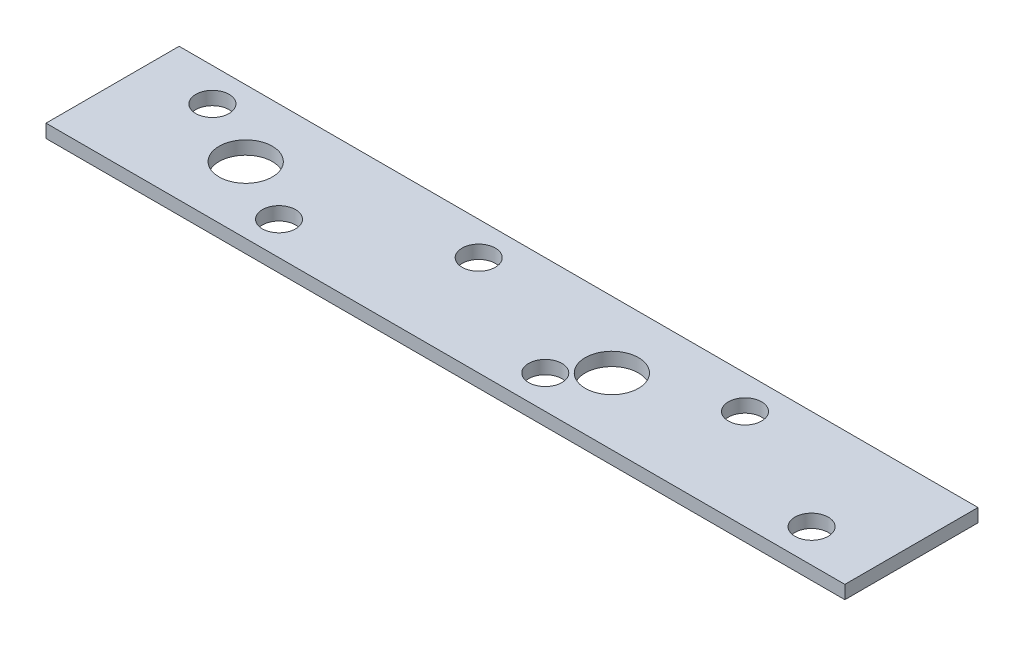
ISO-10303-21;
HEADER;
FILE_DESCRIPTION(('STEP AP214'),'2;1');
FILE_NAME('part.step','',(''),(''),'','','');
FILE_SCHEMA(('AUTOMOTIVE_DESIGN { 1 0 10303 214 1 1 1 1 }'));
ENDSEC;
DATA;
#1=APPLICATION_CONTEXT('core data for automotive mechanical design processes');
#2=APPLICATION_PROTOCOL_DEFINITION('international standard','automotive_design',2000,#1);
#3=PRODUCT_CONTEXT('',#1,'mechanical');
#4=PRODUCT('Part','Part','',(#3));
#5=PRODUCT_RELATED_PRODUCT_CATEGORY('part','',(#4));
#6=PRODUCT_DEFINITION_FORMATION('','',#4);
#7=PRODUCT_DEFINITION_CONTEXT('part definition',#1,'design');
#8=PRODUCT_DEFINITION('design','',#6,#7);
#9=PRODUCT_DEFINITION_SHAPE('','',#8);
#10=(LENGTH_UNIT() NAMED_UNIT(*) SI_UNIT(.MILLI.,.METRE.));
#11=(NAMED_UNIT(*) PLANE_ANGLE_UNIT() SI_UNIT($,.RADIAN.));
#12=(NAMED_UNIT(*) SI_UNIT($,.STERADIAN.) SOLID_ANGLE_UNIT());
#13=UNCERTAINTY_MEASURE_WITH_UNIT(LENGTH_MEASURE(1.E-05),#10,'distance_accuracy_value','');
#14=(GEOMETRIC_REPRESENTATION_CONTEXT(3) GLOBAL_UNCERTAINTY_ASSIGNED_CONTEXT((#13)) GLOBAL_UNIT_ASSIGNED_CONTEXT((#10,
#11,#12)) REPRESENTATION_CONTEXT('',''));
#15=CARTESIAN_POINT('',(0.,0.,0.));
#16=DIRECTION('',(0.,0.,1.));
#17=DIRECTION('',(1.,0.,0.));
#18=AXIS2_PLACEMENT_3D('',#15,#16,#17);
#19=CARTESIAN_POINT('',(0.,2.,0.));
#20=DIRECTION('',(0.,1.,0.));
#21=DIRECTION('',(0.,0.,1.));
#22=AXIS2_PLACEMENT_3D('',#19,#20,#21);
#23=PLANE('',#22);
#24=CARTESIAN_POINT('',(50.0000000000001,2.,5.));
#25=DIRECTION('',(0.,1.,0.));
#26=DIRECTION('',(0.,0.,1.));
#27=AXIS2_PLACEMENT_3D('',#24,#25,#26);
#28=CIRCLE('',#27,2.5);
#29=CARTESIAN_POINT('',(50.0000000000001,2.,7.5));
#30=VERTEX_POINT('',#29);
#31=EDGE_CURVE('E174',#30,#30,#28,.T.);
#32=ORIENTED_EDGE('',*,*,#31,.F.);
#33=EDGE_LOOP('',(#32));
#34=FACE_BOUND('',#33,.T.);
#35=CARTESIAN_POINT('',(-29.9999999999999,2.,5.));
#36=DIRECTION('',(0.,1.,0.));
#37=DIRECTION('',(0.,0.,1.));
#38=AXIS2_PLACEMENT_3D('',#35,#36,#37);
#39=CIRCLE('',#38,2.5);
#40=CARTESIAN_POINT('',(-29.9999999999999,2.,7.5));
#41=VERTEX_POINT('',#40);
#42=EDGE_CURVE('E158',#41,#41,#39,.T.);
#43=ORIENTED_EDGE('',*,*,#42,.F.);
#44=EDGE_LOOP('',(#43));
#45=FACE_BOUND('',#44,.T.);
#46=CARTESIAN_POINT('',(-10.,2.,-5.));
#47=DIRECTION('',(0.,1.,0.));
#48=DIRECTION('',(0.,0.,1.));
#49=AXIS2_PLACEMENT_3D('',#46,#47,#48);
#50=CIRCLE('',#49,2.49999999999999);
#51=CARTESIAN_POINT('',(-10.,2.,-2.5));
#52=VERTEX_POINT('',#51);
#53=EDGE_CURVE('E142',#52,#52,#50,.T.);
#54=ORIENTED_EDGE('',*,*,#53,.F.);
#55=EDGE_LOOP('',(#54));
#56=FACE_BOUND('',#55,.T.);
#57=CARTESIAN_POINT('',(-50.,2.,-5.));
#58=DIRECTION('',(0.,1.,0.));
#59=DIRECTION('',(0.,0.,1.));
#60=AXIS2_PLACEMENT_3D('',#57,#58,#59);
#61=CIRCLE('',#60,2.5);
#62=CARTESIAN_POINT('',(-50.,2.,-2.5));
#63=VERTEX_POINT('',#62);
#64=EDGE_CURVE('E112',#63,#63,#61,.T.);
#65=ORIENTED_EDGE('',*,*,#64,.F.);
#66=EDGE_LOOP('',(#65));
#67=FACE_BOUND('',#66,.T.);
#68=DIRECTION('',(0.,0.,-1.));
#69=VECTOR('',#68,1.);
#70=CARTESIAN_POINT('',(60.,2.,-10.));
#71=LINE('',#70,#69);
#72=CARTESIAN_POINT('',(60.,2.,10.));
#73=VERTEX_POINT('',#72);
#74=CARTESIAN_POINT('',(60.,2.,-10.));
#75=VERTEX_POINT('',#74);
#76=EDGE_CURVE('E92',#73,#75,#71,.T.);
#77=ORIENTED_EDGE('',*,*,#76,.T.);
#78=DIRECTION('',(-1.,0.,0.));
#79=VECTOR('',#78,1.);
#80=CARTESIAN_POINT('',(-60.,2.,-10.));
#81=LINE('',#80,#79);
#82=CARTESIAN_POINT('',(-60.,2.,-10.));
#83=VERTEX_POINT('',#82);
#84=EDGE_CURVE('E87',#75,#83,#81,.T.);
#85=ORIENTED_EDGE('',*,*,#84,.T.);
#86=DIRECTION('',(0.,0.,1.));
#87=VECTOR('',#86,1.);
#88=CARTESIAN_POINT('',(-60.,2.,-10.));
#89=LINE('',#88,#87);
#90=CARTESIAN_POINT('',(-60.,2.,10.));
#91=VERTEX_POINT('',#90);
#92=EDGE_CURVE('E90',#83,#91,#89,.T.);
#93=ORIENTED_EDGE('',*,*,#92,.T.);
#94=DIRECTION('',(1.,0.,0.));
#95=VECTOR('',#94,1.);
#96=CARTESIAN_POINT('',(-60.,2.,10.));
#97=LINE('',#96,#95);
#98=EDGE_CURVE('E57',#91,#73,#97,.T.);
#99=ORIENTED_EDGE('',*,*,#98,.T.);
#100=EDGE_LOOP('',(#77,#85,#93,#99));
#101=FACE_BOUND('',#100,.T.);
#102=CARTESIAN_POINT('',(-39.9999999999999,2.,0.));
#103=DIRECTION('',(0.,1.,0.));
#104=DIRECTION('',(0.,0.,1.));
#105=AXIS2_PLACEMENT_3D('',#102,#103,#104);
#106=CIRCLE('',#105,4.);
#107=CARTESIAN_POINT('',(-39.9999999999999,2.,4.));
#108=VERTEX_POINT('',#107);
#109=EDGE_CURVE('E134',#108,#108,#106,.T.);
#110=ORIENTED_EDGE('',*,*,#109,.F.);
#111=EDGE_LOOP('',(#110));
#112=FACE_BOUND('',#111,.T.);
#113=CARTESIAN_POINT('',(30.,2.,-5.));
#114=DIRECTION('',(0.,1.,0.));
#115=DIRECTION('',(0.,0.,1.));
#116=AXIS2_PLACEMENT_3D('',#113,#114,#115);
#117=CIRCLE('',#116,2.5);
#118=CARTESIAN_POINT('',(30.,2.,-2.5));
#119=VERTEX_POINT('',#118);
#120=EDGE_CURVE('E150',#119,#119,#117,.T.);
#121=ORIENTED_EDGE('',*,*,#120,.F.);
#122=EDGE_LOOP('',(#121));
#123=FACE_BOUND('',#122,.T.);
#124=CARTESIAN_POINT('',(10.0000000000001,2.,5.));
#125=DIRECTION('',(0.,1.,0.));
#126=DIRECTION('',(0.,0.,1.));
#127=AXIS2_PLACEMENT_3D('',#124,#125,#126);
#128=CIRCLE('',#127,2.5);
#129=CARTESIAN_POINT('',(10.0000000000001,2.,7.5));
#130=VERTEX_POINT('',#129);
#131=EDGE_CURVE('E166',#130,#130,#128,.T.);
#132=ORIENTED_EDGE('',*,*,#131,.F.);
#133=EDGE_LOOP('',(#132));
#134=FACE_BOUND('',#133,.T.);
#135=CARTESIAN_POINT('',(15.,2.,0.));
#136=DIRECTION('',(0.,1.,0.));
#137=DIRECTION('',(0.,0.,1.));
#138=AXIS2_PLACEMENT_3D('',#135,#136,#137);
#139=CIRCLE('',#138,4.);
#140=CARTESIAN_POINT('',(15.,2.,4.));
#141=VERTEX_POINT('',#140);
#142=EDGE_CURVE('E182',#141,#141,#139,.T.);
#143=ORIENTED_EDGE('',*,*,#142,.F.);
#144=EDGE_LOOP('',(#143));
#145=FACE_BOUND('',#144,.T.);
#146=ADVANCED_FACE('F39',(#34,#45,#56,#67,#101,#112,#123,#134,#145),#23,.T.);
#147=CARTESIAN_POINT('',(0.,0.,0.));
#148=DIRECTION('',(0.,1.,0.));
#149=DIRECTION('',(0.,0.,1.));
#150=AXIS2_PLACEMENT_3D('',#147,#148,#149);
#151=PLANE('',#150);
#152=DIRECTION('',(0.,0.,-1.));
#153=VECTOR('',#152,1.);
#154=CARTESIAN_POINT('',(60.,0.,-10.));
#155=LINE('',#154,#153);
#156=CARTESIAN_POINT('',(60.,0.,10.));
#157=VERTEX_POINT('',#156);
#158=CARTESIAN_POINT('',(60.,0.,-10.));
#159=VERTEX_POINT('',#158);
#160=EDGE_CURVE('E108',#157,#159,#155,.T.);
#161=ORIENTED_EDGE('',*,*,#160,.F.);
#162=DIRECTION('',(1.,0.,0.));
#163=VECTOR('',#162,1.);
#164=CARTESIAN_POINT('',(-60.,0.,10.));
#165=LINE('',#164,#163);
#166=CARTESIAN_POINT('',(-60.,0.,10.));
#167=VERTEX_POINT('',#166);
#168=EDGE_CURVE('E80',#167,#157,#165,.T.);
#169=ORIENTED_EDGE('',*,*,#168,.F.);
#170=DIRECTION('',(0.,0.,1.));
#171=VECTOR('',#170,1.);
#172=CARTESIAN_POINT('',(-60.,0.,-10.));
#173=LINE('',#172,#171);
#174=CARTESIAN_POINT('',(-60.,0.,-10.));
#175=VERTEX_POINT('',#174);
#176=EDGE_CURVE('E74',#175,#167,#173,.T.);
#177=ORIENTED_EDGE('',*,*,#176,.F.);
#178=DIRECTION('',(-1.,0.,0.));
#179=VECTOR('',#178,1.);
#180=CARTESIAN_POINT('',(-60.,0.,-10.));
#181=LINE('',#180,#179);
#182=EDGE_CURVE('E97',#159,#175,#181,.T.);
#183=ORIENTED_EDGE('',*,*,#182,.F.);
#184=EDGE_LOOP('',(#161,#169,#177,#183));
#185=FACE_BOUND('',#184,.T.);
#186=CARTESIAN_POINT('',(-50.,0.,-5.));
#187=DIRECTION('',(0.,1.,0.));
#188=DIRECTION('',(0.,0.,1.));
#189=AXIS2_PLACEMENT_3D('',#186,#187,#188);
#190=CIRCLE('',#189,2.5);
#191=CARTESIAN_POINT('',(-50.,0.,-2.5));
#192=VERTEX_POINT('',#191);
#193=EDGE_CURVE('E130',#192,#192,#190,.T.);
#194=ORIENTED_EDGE('',*,*,#193,.T.);
#195=EDGE_LOOP('',(#194));
#196=FACE_BOUND('',#195,.T.);
#197=CARTESIAN_POINT('',(-39.9999999999999,0.,0.));
#198=DIRECTION('',(0.,1.,0.));
#199=DIRECTION('',(0.,0.,1.));
#200=AXIS2_PLACEMENT_3D('',#197,#198,#199);
#201=CIRCLE('',#200,4.);
#202=CARTESIAN_POINT('',(-39.9999999999999,0.,4.));
#203=VERTEX_POINT('',#202);
#204=EDGE_CURVE('E138',#203,#203,#201,.T.);
#205=ORIENTED_EDGE('',*,*,#204,.T.);
#206=EDGE_LOOP('',(#205));
#207=FACE_BOUND('',#206,.T.);
#208=CARTESIAN_POINT('',(-10.,0.,-5.));
#209=DIRECTION('',(0.,1.,0.));
#210=DIRECTION('',(0.,0.,1.));
#211=AXIS2_PLACEMENT_3D('',#208,#209,#210);
#212=CIRCLE('',#211,2.49999999999999);
#213=CARTESIAN_POINT('',(-10.,0.,-2.5));
#214=VERTEX_POINT('',#213);
#215=EDGE_CURVE('E146',#214,#214,#212,.T.);
#216=ORIENTED_EDGE('',*,*,#215,.T.);
#217=EDGE_LOOP('',(#216));
#218=FACE_BOUND('',#217,.T.);
#219=CARTESIAN_POINT('',(30.,0.,-5.));
#220=DIRECTION('',(0.,1.,0.));
#221=DIRECTION('',(0.,0.,1.));
#222=AXIS2_PLACEMENT_3D('',#219,#220,#221);
#223=CIRCLE('',#222,2.5);
#224=CARTESIAN_POINT('',(30.,0.,-2.5));
#225=VERTEX_POINT('',#224);
#226=EDGE_CURVE('E154',#225,#225,#223,.T.);
#227=ORIENTED_EDGE('',*,*,#226,.T.);
#228=EDGE_LOOP('',(#227));
#229=FACE_BOUND('',#228,.T.);
#230=CARTESIAN_POINT('',(-29.9999999999999,0.,5.));
#231=DIRECTION('',(0.,1.,0.));
#232=DIRECTION('',(0.,0.,1.));
#233=AXIS2_PLACEMENT_3D('',#230,#231,#232);
#234=CIRCLE('',#233,2.5);
#235=CARTESIAN_POINT('',(-29.9999999999999,0.,7.5));
#236=VERTEX_POINT('',#235);
#237=EDGE_CURVE('E162',#236,#236,#234,.T.);
#238=ORIENTED_EDGE('',*,*,#237,.T.);
#239=EDGE_LOOP('',(#238));
#240=FACE_BOUND('',#239,.T.);
#241=CARTESIAN_POINT('',(10.0000000000001,0.,5.));
#242=DIRECTION('',(0.,1.,0.));
#243=DIRECTION('',(0.,0.,1.));
#244=AXIS2_PLACEMENT_3D('',#241,#242,#243);
#245=CIRCLE('',#244,2.5);
#246=CARTESIAN_POINT('',(10.0000000000001,0.,7.5));
#247=VERTEX_POINT('',#246);
#248=EDGE_CURVE('E170',#247,#247,#245,.T.);
#249=ORIENTED_EDGE('',*,*,#248,.T.);
#250=EDGE_LOOP('',(#249));
#251=FACE_BOUND('',#250,.T.);
#252=CARTESIAN_POINT('',(50.0000000000001,0.,5.));
#253=DIRECTION('',(0.,1.,0.));
#254=DIRECTION('',(0.,0.,1.));
#255=AXIS2_PLACEMENT_3D('',#252,#253,#254);
#256=CIRCLE('',#255,2.5);
#257=CARTESIAN_POINT('',(50.0000000000001,0.,7.5));
#258=VERTEX_POINT('',#257);
#259=EDGE_CURVE('E178',#258,#258,#256,.T.);
#260=ORIENTED_EDGE('',*,*,#259,.T.);
#261=EDGE_LOOP('',(#260));
#262=FACE_BOUND('',#261,.T.);
#263=CARTESIAN_POINT('',(15.,0.,0.));
#264=DIRECTION('',(0.,1.,0.));
#265=DIRECTION('',(0.,0.,1.));
#266=AXIS2_PLACEMENT_3D('',#263,#264,#265);
#267=CIRCLE('',#266,4.);
#268=CARTESIAN_POINT('',(15.,0.,4.));
#269=VERTEX_POINT('',#268);
#270=EDGE_CURVE('E186',#269,#269,#267,.T.);
#271=ORIENTED_EDGE('',*,*,#270,.T.);
#272=EDGE_LOOP('',(#271));
#273=FACE_BOUND('',#272,.T.);
#274=ADVANCED_FACE('F125',(#185,#196,#207,#218,#229,#240,#251,#262,#273),#151,.F.);
#275=CARTESIAN_POINT('',(60.,2.,-10.));
#276=DIRECTION('',(-1.,0.,0.));
#277=DIRECTION('',(0.,0.,1.));
#278=AXIS2_PLACEMENT_3D('',#275,#276,#277);
#279=PLANE('',#278);
#280=ORIENTED_EDGE('',*,*,#160,.T.);
#281=DIRECTION('',(0.,-1.,0.));
#282=VECTOR('',#281,1.);
#283=CARTESIAN_POINT('',(60.,2.,-10.));
#284=LINE('',#283,#282);
#285=EDGE_CURVE('E11',#75,#159,#284,.T.);
#286=ORIENTED_EDGE('',*,*,#285,.F.);
#287=ORIENTED_EDGE('',*,*,#76,.F.);
#288=DIRECTION('',(0.,-1.,0.));
#289=VECTOR('',#288,1.);
#290=CARTESIAN_POINT('',(60.,2.,10.));
#291=LINE('',#290,#289);
#292=EDGE_CURVE('E104',#73,#157,#291,.T.);
#293=ORIENTED_EDGE('',*,*,#292,.T.);
#294=EDGE_LOOP('',(#280,#286,#287,#293));
#295=FACE_BOUND('',#294,.T.);
#296=ADVANCED_FACE('F41',(#295),#279,.F.);
#297=CARTESIAN_POINT('',(-60.,2.,-10.));
#298=DIRECTION('',(0.,0.,1.));
#299=DIRECTION('',(1.,0.,0.));
#300=AXIS2_PLACEMENT_3D('',#297,#298,#299);
#301=PLANE('',#300);
#302=ORIENTED_EDGE('',*,*,#182,.T.);
#303=DIRECTION('',(0.,-1.,0.));
#304=VECTOR('',#303,1.);
#305=CARTESIAN_POINT('',(-60.,2.,-10.));
#306=LINE('',#305,#304);
#307=EDGE_CURVE('E49',#83,#175,#306,.T.);
#308=ORIENTED_EDGE('',*,*,#307,.F.);
#309=ORIENTED_EDGE('',*,*,#84,.F.);
#310=ORIENTED_EDGE('',*,*,#285,.T.);
#311=EDGE_LOOP('',(#302,#308,#309,#310));
#312=FACE_BOUND('',#311,.T.);
#313=ADVANCED_FACE('F96',(#312),#301,.F.);
#314=CARTESIAN_POINT('',(-60.,2.,-10.));
#315=DIRECTION('',(1.,0.,0.));
#316=DIRECTION('',(0.,0.,-1.));
#317=AXIS2_PLACEMENT_3D('',#314,#315,#316);
#318=PLANE('',#317);
#319=ORIENTED_EDGE('',*,*,#176,.T.);
#320=DIRECTION('',(0.,-1.,0.));
#321=VECTOR('',#320,1.);
#322=CARTESIAN_POINT('',(-60.,2.,10.));
#323=LINE('',#322,#321);
#324=EDGE_CURVE('E99',#91,#167,#323,.T.);
#325=ORIENTED_EDGE('',*,*,#324,.F.);
#326=ORIENTED_EDGE('',*,*,#92,.F.);
#327=ORIENTED_EDGE('',*,*,#307,.T.);
#328=EDGE_LOOP('',(#319,#325,#326,#327));
#329=FACE_BOUND('',#328,.T.);
#330=ADVANCED_FACE('F100',(#329),#318,.F.);
#331=CARTESIAN_POINT('',(-60.,2.,10.));
#332=DIRECTION('',(0.,0.,-1.));
#333=DIRECTION('',(-1.,0.,0.));
#334=AXIS2_PLACEMENT_3D('',#331,#332,#333);
#335=PLANE('',#334);
#336=ORIENTED_EDGE('',*,*,#168,.T.);
#337=ORIENTED_EDGE('',*,*,#292,.F.);
#338=ORIENTED_EDGE('',*,*,#98,.F.);
#339=ORIENTED_EDGE('',*,*,#324,.T.);
#340=EDGE_LOOP('',(#336,#337,#338,#339));
#341=FACE_BOUND('',#340,.T.);
#342=ADVANCED_FACE('F122',(#341),#335,.F.);
#343=CARTESIAN_POINT('',(-50.,2.,-5.));
#344=DIRECTION('',(0.,-1.,0.));
#345=DIRECTION('',(0.,0.,-1.));
#346=AXIS2_PLACEMENT_3D('',#343,#344,#345);
#347=CYLINDRICAL_SURFACE('',#346,2.5);
#348=ORIENTED_EDGE('',*,*,#64,.T.);
#349=EDGE_LOOP('',(#348));
#350=FACE_BOUND('',#349,.T.);
#351=ORIENTED_EDGE('',*,*,#193,.F.);
#352=EDGE_LOOP('',(#351));
#353=FACE_BOUND('',#352,.T.);
#354=ADVANCED_FACE('F207',(#350,#353),#347,.F.);
#355=CARTESIAN_POINT('',(-39.9999999999999,2.,0.));
#356=DIRECTION('',(0.,-1.,0.));
#357=DIRECTION('',(0.,0.,-1.));
#358=AXIS2_PLACEMENT_3D('',#355,#356,#357);
#359=CYLINDRICAL_SURFACE('',#358,4.);
#360=ORIENTED_EDGE('',*,*,#109,.T.);
#361=EDGE_LOOP('',(#360));
#362=FACE_BOUND('',#361,.T.);
#363=ORIENTED_EDGE('',*,*,#204,.F.);
#364=EDGE_LOOP('',(#363));
#365=FACE_BOUND('',#364,.T.);
#366=ADVANCED_FACE('F253',(#362,#365),#359,.F.);
#367=CARTESIAN_POINT('',(-10.,2.,-5.));
#368=DIRECTION('',(0.,-1.,0.));
#369=DIRECTION('',(0.,0.,-1.));
#370=AXIS2_PLACEMENT_3D('',#367,#368,#369);
#371=CYLINDRICAL_SURFACE('',#370,2.49999999999999);
#372=ORIENTED_EDGE('',*,*,#53,.T.);
#373=EDGE_LOOP('',(#372));
#374=FACE_BOUND('',#373,.T.);
#375=ORIENTED_EDGE('',*,*,#215,.F.);
#376=EDGE_LOOP('',(#375));
#377=FACE_BOUND('',#376,.T.);
#378=ADVANCED_FACE('F261',(#374,#377),#371,.F.);
#379=CARTESIAN_POINT('',(30.,2.,-5.));
#380=DIRECTION('',(0.,-1.,0.));
#381=DIRECTION('',(0.,0.,-1.));
#382=AXIS2_PLACEMENT_3D('',#379,#380,#381);
#383=CYLINDRICAL_SURFACE('',#382,2.5);
#384=ORIENTED_EDGE('',*,*,#120,.T.);
#385=EDGE_LOOP('',(#384));
#386=FACE_BOUND('',#385,.T.);
#387=ORIENTED_EDGE('',*,*,#226,.F.);
#388=EDGE_LOOP('',(#387));
#389=FACE_BOUND('',#388,.T.);
#390=ADVANCED_FACE('F269',(#386,#389),#383,.F.);
#391=CARTESIAN_POINT('',(-29.9999999999999,2.,5.));
#392=DIRECTION('',(0.,-1.,0.));
#393=DIRECTION('',(0.,0.,-1.));
#394=AXIS2_PLACEMENT_3D('',#391,#392,#393);
#395=CYLINDRICAL_SURFACE('',#394,2.5);
#396=ORIENTED_EDGE('',*,*,#42,.T.);
#397=EDGE_LOOP('',(#396));
#398=FACE_BOUND('',#397,.T.);
#399=ORIENTED_EDGE('',*,*,#237,.F.);
#400=EDGE_LOOP('',(#399));
#401=FACE_BOUND('',#400,.T.);
#402=ADVANCED_FACE('F278',(#398,#401),#395,.F.);
#403=CARTESIAN_POINT('',(10.0000000000001,2.,5.));
#404=DIRECTION('',(0.,-1.,0.));
#405=DIRECTION('',(0.,0.,-1.));
#406=AXIS2_PLACEMENT_3D('',#403,#404,#405);
#407=CYLINDRICAL_SURFACE('',#406,2.5);
#408=ORIENTED_EDGE('',*,*,#131,.T.);
#409=EDGE_LOOP('',(#408));
#410=FACE_BOUND('',#409,.T.);
#411=ORIENTED_EDGE('',*,*,#248,.F.);
#412=EDGE_LOOP('',(#411));
#413=FACE_BOUND('',#412,.T.);
#414=ADVANCED_FACE('F287',(#410,#413),#407,.F.);
#415=CARTESIAN_POINT('',(50.0000000000001,2.,5.));
#416=DIRECTION('',(0.,-1.,0.));
#417=DIRECTION('',(0.,0.,-1.));
#418=AXIS2_PLACEMENT_3D('',#415,#416,#417);
#419=CYLINDRICAL_SURFACE('',#418,2.5);
#420=ORIENTED_EDGE('',*,*,#31,.T.);
#421=EDGE_LOOP('',(#420));
#422=FACE_BOUND('',#421,.T.);
#423=ORIENTED_EDGE('',*,*,#259,.F.);
#424=EDGE_LOOP('',(#423));
#425=FACE_BOUND('',#424,.T.);
#426=ADVANCED_FACE('F296',(#422,#425),#419,.F.);
#427=CARTESIAN_POINT('',(15.,2.,0.));
#428=DIRECTION('',(0.,-1.,0.));
#429=DIRECTION('',(0.,0.,-1.));
#430=AXIS2_PLACEMENT_3D('',#427,#428,#429);
#431=CYLINDRICAL_SURFACE('',#430,4.);
#432=ORIENTED_EDGE('',*,*,#142,.T.);
#433=EDGE_LOOP('',(#432));
#434=FACE_BOUND('',#433,.T.);
#435=ORIENTED_EDGE('',*,*,#270,.F.);
#436=EDGE_LOOP('',(#435));
#437=FACE_BOUND('',#436,.T.);
#438=ADVANCED_FACE('F194',(#434,#437),#431,.F.);
#439=CLOSED_SHELL('',(#146,#274,#296,#313,#330,#342,#354,#366,#378,#390,#402,#414,#426,#438));
#440=MANIFOLD_SOLID_BREP('B2',#439);
#441=ADVANCED_BREP_SHAPE_REPRESENTATION('',(#18,#440),#14);
#442=SHAPE_DEFINITION_REPRESENTATION(#9,#441);
ENDSEC;
END-ISO-10303-21;
